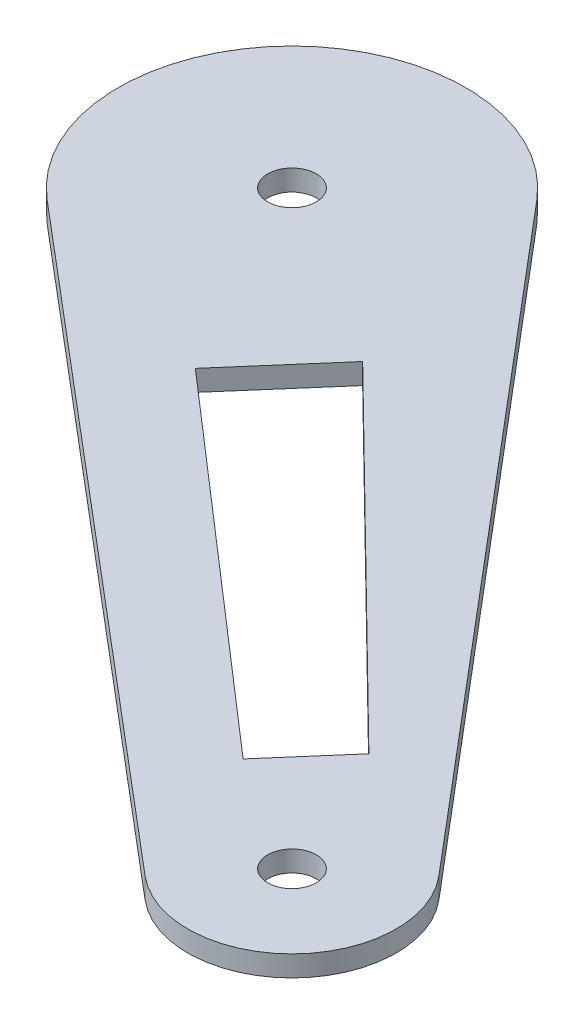
ISO-10303-21;
HEADER;
FILE_DESCRIPTION(('STEP AP214'),'2;1');
FILE_NAME('part.step','',(''),(''),'','','');
FILE_SCHEMA(('AUTOMOTIVE_DESIGN { 1 0 10303 214 1 1 1 1 }'));
ENDSEC;
DATA;
#1=APPLICATION_CONTEXT('core data for automotive mechanical design processes');
#2=APPLICATION_PROTOCOL_DEFINITION('international standard','automotive_design',2000,#1);
#3=PRODUCT_CONTEXT('',#1,'mechanical');
#4=PRODUCT('Part','Part','',(#3));
#5=PRODUCT_RELATED_PRODUCT_CATEGORY('part','',(#4));
#6=PRODUCT_DEFINITION_FORMATION('','',#4);
#7=PRODUCT_DEFINITION_CONTEXT('part definition',#1,'design');
#8=PRODUCT_DEFINITION('design','',#6,#7);
#9=PRODUCT_DEFINITION_SHAPE('','',#8);
#10=(LENGTH_UNIT() NAMED_UNIT(*) SI_UNIT(.MILLI.,.METRE.));
#11=(NAMED_UNIT(*) PLANE_ANGLE_UNIT() SI_UNIT($,.RADIAN.));
#12=(NAMED_UNIT(*) SI_UNIT($,.STERADIAN.) SOLID_ANGLE_UNIT());
#13=UNCERTAINTY_MEASURE_WITH_UNIT(LENGTH_MEASURE(1.E-05),#10,'distance_accuracy_value','');
#14=(GEOMETRIC_REPRESENTATION_CONTEXT(3) GLOBAL_UNCERTAINTY_ASSIGNED_CONTEXT((#13)) GLOBAL_UNIT_ASSIGNED_CONTEXT((#10,
#11,#12)) REPRESENTATION_CONTEXT('',''));
#15=CARTESIAN_POINT('',(0.,0.,0.));
#16=DIRECTION('',(0.,0.,1.));
#17=DIRECTION('',(1.,0.,0.));
#18=AXIS2_PLACEMENT_3D('',#15,#16,#17);
#19=CARTESIAN_POINT('',(-12.9144341357622,3.,15.2714567397174));
#20=DIRECTION('',(0.645721706788111,0.,-0.763572836985869));
#21=DIRECTION('',(-0.763572836985869,0.,-0.645721706788111));
#22=AXIS2_PLACEMENT_3D('',#19,#20,#21);
#23=PLANE('',#22);
#24=DIRECTION('',(0.763572836985869,0.,0.645721706788111));
#25=VECTOR('',#24,1.);
#26=CARTESIAN_POINT('',(-12.9144341357622,0.,15.2714567397174));
#27=LINE('',#26,#25);
#28=CARTESIAN_POINT('',(-58.5694495408956,0.,-23.3370859465461));
#29=VERTEX_POINT('',#28);
#30=CARTESIAN_POINT('',(32.7405812693714,0.,53.8799994259806));
#31=VERTEX_POINT('',#30);
#32=EDGE_CURVE('E172',#29,#31,#27,.T.);
#33=ORIENTED_EDGE('',*,*,#32,.T.);
#34=DIRECTION('',(0.,-1.,0.));
#35=VECTOR('',#34,1.);
#36=CARTESIAN_POINT('',(32.7405812693714,3.,53.8799994259806));
#37=LINE('',#36,#35);
#38=CARTESIAN_POINT('',(32.7405812693714,3.,53.8799994259806));
#39=VERTEX_POINT('',#38);
#40=EDGE_CURVE('E11',#39,#31,#37,.T.);
#41=ORIENTED_EDGE('',*,*,#40,.F.);
#42=DIRECTION('',(0.763572836985869,0.,0.645721706788111));
#43=VECTOR('',#42,1.);
#44=CARTESIAN_POINT('',(-12.9144341357622,3.,15.2714567397174));
#45=LINE('',#44,#43);
#46=CARTESIAN_POINT('',(-58.5694495408956,3.,-23.3370859465461));
#47=VERTEX_POINT('',#46);
#48=EDGE_CURVE('E176',#47,#39,#45,.T.);
#49=ORIENTED_EDGE('',*,*,#48,.F.);
#50=DIRECTION('',(0.,-1.,0.));
#51=VECTOR('',#50,1.);
#52=CARTESIAN_POINT('',(-58.5694495408956,3.,-23.3370859465461));
#53=LINE('',#52,#51);
#54=EDGE_CURVE('E191',#47,#29,#53,.T.);
#55=ORIENTED_EDGE('',*,*,#54,.T.);
#56=EDGE_LOOP('',(#33,#41,#49,#55));
#57=FACE_BOUND('',#56,.T.);
#58=ADVANCED_FACE('F46',(#57),#23,.F.);
#59=CARTESIAN_POINT('',(42.4264068711934,3.,42.4264068711923));
#60=DIRECTION('',(0.,-1.,0.));
#61=DIRECTION('',(0.,0.,-1.));
#62=AXIS2_PLACEMENT_3D('',#59,#60,#61);
#63=CYLINDRICAL_SURFACE('',#62,15.);
#64=CARTESIAN_POINT('',(42.4264068711934,0.,42.4264068711923));
#65=DIRECTION('',(0.,1.,0.));
#66=DIRECTION('',(0.,0.,1.));
#67=AXIS2_PLACEMENT_3D('',#64,#65,#66);
#68=CIRCLE('',#67,15.);
#69=CARTESIAN_POINT('',(53.8799994259812,0.,32.740581269371));
#70=VERTEX_POINT('',#69);
#71=EDGE_CURVE('E195',#31,#70,#68,.T.);
#72=ORIENTED_EDGE('',*,*,#71,.T.);
#73=DIRECTION('',(0.,-1.,0.));
#74=VECTOR('',#73,1.);
#75=CARTESIAN_POINT('',(53.8799994259812,3.,32.740581269371));
#76=LINE('',#75,#74);
#77=CARTESIAN_POINT('',(53.8799994259812,3.,32.740581269371));
#78=VERTEX_POINT('',#77);
#79=EDGE_CURVE('E54',#78,#70,#76,.T.);
#80=ORIENTED_EDGE('',*,*,#79,.F.);
#81=CARTESIAN_POINT('',(42.4264068711934,3.,42.4264068711923));
#82=DIRECTION('',(0.,1.,0.));
#83=DIRECTION('',(0.,0.,1.));
#84=AXIS2_PLACEMENT_3D('',#81,#82,#83);
#85=CIRCLE('',#84,15.);
#86=EDGE_CURVE('E180',#39,#78,#85,.T.);
#87=ORIENTED_EDGE('',*,*,#86,.F.);
#88=ORIENTED_EDGE('',*,*,#40,.T.);
#89=EDGE_LOOP('',(#72,#80,#87,#88));
#90=FACE_BOUND('',#89,.T.);
#91=ADVANCED_FACE('F217',(#90),#63,.T.);
#92=CARTESIAN_POINT('',(15.2714567397174,3.,-12.9144341357622));
#93=DIRECTION('',(0.763572836985869,0.,-0.645721706788111));
#94=DIRECTION('',(-0.645721706788111,0.,-0.763572836985869));
#95=AXIS2_PLACEMENT_3D('',#92,#93,#94);
#96=PLANE('',#95);
#97=DIRECTION('',(0.645721706788111,0.,0.763572836985869));
#98=VECTOR('',#97,1.);
#99=CARTESIAN_POINT('',(15.2714567397174,0.,-12.9144341357622));
#100=LINE('',#99,#98);
#101=CARTESIAN_POINT('',(-23.3370859465461,0.,-58.5694495408956));
#102=VERTEX_POINT('',#101);
#103=EDGE_CURVE('E199',#102,#70,#100,.T.);
#104=ORIENTED_EDGE('',*,*,#103,.F.);
#105=DIRECTION('',(0.,-1.,0.));
#106=VECTOR('',#105,1.);
#107=CARTESIAN_POINT('',(-23.3370859465461,3.,-58.5694495408956));
#108=LINE('',#107,#106);
#109=CARTESIAN_POINT('',(-23.3370859465461,3.,-58.5694495408956));
#110=VERTEX_POINT('',#109);
#111=EDGE_CURVE('E208',#110,#102,#108,.T.);
#112=ORIENTED_EDGE('',*,*,#111,.F.);
#113=DIRECTION('',(0.645721706788111,0.,0.763572836985869));
#114=VECTOR('',#113,1.);
#115=CARTESIAN_POINT('',(15.2714567397174,3.,-12.9144341357622));
#116=LINE('',#115,#114);
#117=EDGE_CURVE('E184',#110,#78,#116,.T.);
#118=ORIENTED_EDGE('',*,*,#117,.T.);
#119=ORIENTED_EDGE('',*,*,#79,.T.);
#120=EDGE_LOOP('',(#104,#112,#118,#119));
#121=FACE_BOUND('',#120,.T.);
#122=ADVANCED_FACE('F214',(#121),#96,.T.);
#123=CARTESIAN_POINT('',(-42.4264068711929,3.,-42.4264068711928));
#124=DIRECTION('',(0.,-1.,0.));
#125=DIRECTION('',(0.,0.,-1.));
#126=AXIS2_PLACEMENT_3D('',#123,#124,#125);
#127=CYLINDRICAL_SURFACE('',#126,25.);
#128=CARTESIAN_POINT('',(-42.4264068711929,0.,-42.4264068711928));
#129=DIRECTION('',(0.,1.,0.));
#130=DIRECTION('',(0.,0.,1.));
#131=AXIS2_PLACEMENT_3D('',#128,#129,#130);
#132=CIRCLE('',#131,25.);
#133=EDGE_CURVE('E181',#102,#29,#132,.T.);
#134=ORIENTED_EDGE('',*,*,#133,.T.);
#135=ORIENTED_EDGE('',*,*,#54,.F.);
#136=CARTESIAN_POINT('',(-42.4264068711929,3.,-42.4264068711928));
#137=DIRECTION('',(0.,1.,0.));
#138=DIRECTION('',(0.,0.,1.));
#139=AXIS2_PLACEMENT_3D('',#136,#137,#138);
#140=CIRCLE('',#139,25.);
#141=EDGE_CURVE('E188',#110,#47,#140,.T.);
#142=ORIENTED_EDGE('',*,*,#141,.F.);
#143=ORIENTED_EDGE('',*,*,#111,.T.);
#144=EDGE_LOOP('',(#134,#135,#142,#143));
#145=FACE_BOUND('',#144,.T.);
#146=ADVANCED_FACE('F224',(#145),#127,.T.);
#147=CARTESIAN_POINT('',(0.,3.,0.));
#148=DIRECTION('',(0.,1.,0.));
#149=DIRECTION('',(0.,0.,1.));
#150=AXIS2_PLACEMENT_3D('',#147,#148,#149);
#151=PLANE('',#150);
#152=DIRECTION('',(0.655504709377289,0.,-0.75519108574201));
#153=VECTOR('',#152,1.);
#154=CARTESIAN_POINT('',(30.3479863028157,3.,26.3420057746936));
#155=LINE('',#154,#153);
#156=CARTESIAN_POINT('',(25.2188438223983,3.,32.2511664920767));
#157=VERTEX_POINT('',#156);
#158=CARTESIAN_POINT('',(33.6266728578498,3.,22.5647104724889));
#159=VERTEX_POINT('',#158);
#160=EDGE_CURVE('E61',#157,#159,#155,.T.);
#161=ORIENTED_EDGE('',*,*,#160,.F.);
#162=DIRECTION('',(0.75519108574201,0.,0.655504709377289));
#163=VECTOR('',#162,1.);
#164=CARTESIAN_POINT('',(-5.12914248041741,3.,5.90916071738309));
#165=LINE('',#164,#163);
#166=CARTESIAN_POINT('',(-26.8914227625743,3.,-12.9804653402736));
#167=VERTEX_POINT('',#166);
#168=EDGE_CURVE('E132',#167,#157,#165,.T.);
#169=ORIENTED_EDGE('',*,*,#168,.F.);
#170=DIRECTION('',(-0.655504709377289,0.,0.75519108574201));
#171=VECTOR('',#170,1.);
#172=CARTESIAN_POINT('',(-21.7622802821569,3.,-18.8896260576567));
#173=LINE('',#172,#171);
#174=CARTESIAN_POINT('',(-15.7029996650353,3.,-25.8703763750824));
#175=VERTEX_POINT('',#174);
#176=EDGE_CURVE('E136',#175,#167,#173,.T.);
#177=ORIENTED_EDGE('',*,*,#176,.F.);
#178=DIRECTION('',(-0.713547212098277,0.,-0.700607148198458));
#179=VECTOR('',#178,1.);
#180=CARTESIAN_POINT('',(5.22519896008589,3.,-5.32170726521329));
#181=LINE('',#180,#179);
#182=EDGE_CURVE('E145',#159,#175,#181,.T.);
#183=ORIENTED_EDGE('',*,*,#182,.F.);
#184=EDGE_LOOP('',(#161,#169,#177,#183));
#185=FACE_BOUND('',#184,.T.);
#186=CARTESIAN_POINT('',(42.4264068711934,3.,42.4264068711923));
#187=DIRECTION('',(0.,1.,0.));
#188=DIRECTION('',(0.,0.,1.));
#189=AXIS2_PLACEMENT_3D('',#186,#187,#188);
#190=CIRCLE('',#189,3.5);
#191=CARTESIAN_POINT('',(42.4264068711934,3.,45.9264068711923));
#192=VERTEX_POINT('',#191);
#193=EDGE_CURVE('E154',#192,#192,#190,.T.);
#194=ORIENTED_EDGE('',*,*,#193,.F.);
#195=EDGE_LOOP('',(#194));
#196=FACE_BOUND('',#195,.T.);
#197=CARTESIAN_POINT('',(-42.4264068711929,3.,-42.4264068711928));
#198=DIRECTION('',(0.,1.,0.));
#199=DIRECTION('',(0.,0.,1.));
#200=AXIS2_PLACEMENT_3D('',#197,#198,#199);
#201=CIRCLE('',#200,3.5);
#202=CARTESIAN_POINT('',(-42.4264068711929,3.,-38.9264068711928));
#203=VERTEX_POINT('',#202);
#204=EDGE_CURVE('E164',#203,#203,#201,.T.);
#205=ORIENTED_EDGE('',*,*,#204,.F.);
#206=EDGE_LOOP('',(#205));
#207=FACE_BOUND('',#206,.T.);
#208=ORIENTED_EDGE('',*,*,#48,.T.);
#209=ORIENTED_EDGE('',*,*,#86,.T.);
#210=ORIENTED_EDGE('',*,*,#117,.F.);
#211=ORIENTED_EDGE('',*,*,#141,.T.);
#212=EDGE_LOOP('',(#208,#209,#210,#211));
#213=FACE_BOUND('',#212,.T.);
#214=ADVANCED_FACE('F229',(#185,#196,#207,#213),#151,.T.);
#215=CARTESIAN_POINT('',(0.,0.,0.));
#216=DIRECTION('',(0.,1.,0.));
#217=DIRECTION('',(0.,0.,1.));
#218=AXIS2_PLACEMENT_3D('',#215,#216,#217);
#219=PLANE('',#218);
#220=DIRECTION('',(0.75519108574201,0.,0.655504709377289));
#221=VECTOR('',#220,1.);
#222=CARTESIAN_POINT('',(-5.12914248041741,0.,5.90916071738309));
#223=LINE('',#222,#221);
#224=CARTESIAN_POINT('',(-26.8914227625743,0.,-12.9804653402736));
#225=VERTEX_POINT('',#224);
#226=CARTESIAN_POINT('',(25.2188438223983,0.,32.2511664920767));
#227=VERTEX_POINT('',#226);
#228=EDGE_CURVE('E120',#225,#227,#223,.T.);
#229=ORIENTED_EDGE('',*,*,#228,.T.);
#230=DIRECTION('',(0.655504709377289,0.,-0.75519108574201));
#231=VECTOR('',#230,1.);
#232=CARTESIAN_POINT('',(30.3479863028157,0.,26.3420057746936));
#233=LINE('',#232,#231);
#234=CARTESIAN_POINT('',(33.6266728578498,0.,22.5647104724889));
#235=VERTEX_POINT('',#234);
#236=EDGE_CURVE('E113',#227,#235,#233,.T.);
#237=ORIENTED_EDGE('',*,*,#236,.T.);
#238=DIRECTION('',(-0.713547212098277,0.,-0.700607148198458));
#239=VECTOR('',#238,1.);
#240=CARTESIAN_POINT('',(5.22519896008589,0.,-5.32170726521329));
#241=LINE('',#240,#239);
#242=CARTESIAN_POINT('',(-15.7029996650353,0.,-25.8703763750824));
#243=VERTEX_POINT('',#242);
#244=EDGE_CURVE('E123',#235,#243,#241,.T.);
#245=ORIENTED_EDGE('',*,*,#244,.T.);
#246=DIRECTION('',(-0.655504709377289,0.,0.75519108574201));
#247=VECTOR('',#246,1.);
#248=CARTESIAN_POINT('',(-21.7622802821569,0.,-18.8896260576567));
#249=LINE('',#248,#247);
#250=EDGE_CURVE('E69',#243,#225,#249,.T.);
#251=ORIENTED_EDGE('',*,*,#250,.T.);
#252=EDGE_LOOP('',(#229,#237,#245,#251));
#253=FACE_BOUND('',#252,.T.);
#254=CARTESIAN_POINT('',(42.4264068711934,0.,42.4264068711923));
#255=DIRECTION('',(0.,1.,0.));
#256=DIRECTION('',(0.,0.,1.));
#257=AXIS2_PLACEMENT_3D('',#254,#255,#256);
#258=CIRCLE('',#257,3.5);
#259=CARTESIAN_POINT('',(42.4264068711934,0.,45.9264068711923));
#260=VERTEX_POINT('',#259);
#261=EDGE_CURVE('E160',#260,#260,#258,.T.);
#262=ORIENTED_EDGE('',*,*,#261,.T.);
#263=EDGE_LOOP('',(#262));
#264=FACE_BOUND('',#263,.T.);
#265=CARTESIAN_POINT('',(-42.4264068711929,0.,-42.4264068711928));
#266=DIRECTION('',(0.,1.,0.));
#267=DIRECTION('',(0.,0.,1.));
#268=AXIS2_PLACEMENT_3D('',#265,#266,#267);
#269=CIRCLE('',#268,3.5);
#270=CARTESIAN_POINT('',(-42.4264068711929,0.,-38.9264068711928));
#271=VERTEX_POINT('',#270);
#272=EDGE_CURVE('E168',#271,#271,#269,.T.);
#273=ORIENTED_EDGE('',*,*,#272,.T.);
#274=EDGE_LOOP('',(#273));
#275=FACE_BOUND('',#274,.T.);
#276=ORIENTED_EDGE('',*,*,#32,.F.);
#277=ORIENTED_EDGE('',*,*,#133,.F.);
#278=ORIENTED_EDGE('',*,*,#103,.T.);
#279=ORIENTED_EDGE('',*,*,#71,.F.);
#280=EDGE_LOOP('',(#276,#277,#278,#279));
#281=FACE_BOUND('',#280,.T.);
#282=ADVANCED_FACE('F128',(#253,#264,#275,#281),#219,.F.);
#283=CARTESIAN_POINT('',(-42.4264068711929,0.,-42.4264068711928));
#284=DIRECTION('',(0.,1.,0.));
#285=DIRECTION('',(0.,0.,1.));
#286=AXIS2_PLACEMENT_3D('',#283,#284,#285);
#287=CYLINDRICAL_SURFACE('',#286,3.5);
#288=ORIENTED_EDGE('',*,*,#272,.F.);
#289=EDGE_LOOP('',(#288));
#290=FACE_BOUND('',#289,.T.);
#291=ORIENTED_EDGE('',*,*,#204,.T.);
#292=EDGE_LOOP('',(#291));
#293=FACE_BOUND('',#292,.T.);
#294=ADVANCED_FACE('F237',(#290,#293),#287,.F.);
#295=CARTESIAN_POINT('',(42.4264068711934,0.,42.4264068711923));
#296=DIRECTION('',(0.,1.,0.));
#297=DIRECTION('',(0.,0.,1.));
#298=AXIS2_PLACEMENT_3D('',#295,#296,#297);
#299=CYLINDRICAL_SURFACE('',#298,3.5);
#300=ORIENTED_EDGE('',*,*,#261,.F.);
#301=EDGE_LOOP('',(#300));
#302=FACE_BOUND('',#301,.T.);
#303=ORIENTED_EDGE('',*,*,#193,.T.);
#304=EDGE_LOOP('',(#303));
#305=FACE_BOUND('',#304,.T.);
#306=ADVANCED_FACE('F265',(#302,#305),#299,.F.);
#307=CARTESIAN_POINT('',(30.3479863028157,0.,26.3420057746936));
#308=DIRECTION('',(0.75519108574201,0.,0.655504709377289));
#309=DIRECTION('',(0.655504709377289,0.,-0.75519108574201));
#310=AXIS2_PLACEMENT_3D('',#307,#308,#309);
#311=PLANE('',#310);
#312=ORIENTED_EDGE('',*,*,#160,.T.);
#313=DIRECTION('',(0.,1.,0.));
#314=VECTOR('',#313,1.);
#315=CARTESIAN_POINT('',(33.6266728578498,0.,22.5647104724889));
#316=LINE('',#315,#314);
#317=EDGE_CURVE('E109',#235,#159,#316,.T.);
#318=ORIENTED_EDGE('',*,*,#317,.F.);
#319=ORIENTED_EDGE('',*,*,#236,.F.);
#320=DIRECTION('',(0.,1.,0.));
#321=VECTOR('',#320,1.);
#322=CARTESIAN_POINT('',(25.2188438223983,0.,32.2511664920767));
#323=LINE('',#322,#321);
#324=EDGE_CURVE('E151',#227,#157,#323,.T.);
#325=ORIENTED_EDGE('',*,*,#324,.T.);
#326=EDGE_LOOP('',(#312,#318,#319,#325));
#327=FACE_BOUND('',#326,.T.);
#328=ADVANCED_FACE('F111',(#327),#311,.F.);
#329=CARTESIAN_POINT('',(-5.12914248041741,0.,5.90916071738309));
#330=DIRECTION('',(-0.655504709377289,0.,0.75519108574201));
#331=DIRECTION('',(0.75519108574201,0.,0.655504709377289));
#332=AXIS2_PLACEMENT_3D('',#329,#330,#331);
#333=PLANE('',#332);
#334=ORIENTED_EDGE('',*,*,#168,.T.);
#335=ORIENTED_EDGE('',*,*,#324,.F.);
#336=ORIENTED_EDGE('',*,*,#228,.F.);
#337=DIRECTION('',(0.,1.,0.));
#338=VECTOR('',#337,1.);
#339=CARTESIAN_POINT('',(-26.8914227625743,0.,-12.9804653402736));
#340=LINE('',#339,#338);
#341=EDGE_CURVE('E155',#225,#167,#340,.T.);
#342=ORIENTED_EDGE('',*,*,#341,.T.);
#343=EDGE_LOOP('',(#334,#335,#336,#342));
#344=FACE_BOUND('',#343,.T.);
#345=ADVANCED_FACE('F285',(#344),#333,.F.);
#346=CARTESIAN_POINT('',(-21.7622802821569,0.,-18.8896260576567));
#347=DIRECTION('',(-0.75519108574201,0.,-0.655504709377289));
#348=DIRECTION('',(-0.655504709377289,0.,0.75519108574201));
#349=AXIS2_PLACEMENT_3D('',#346,#347,#348);
#350=PLANE('',#349);
#351=ORIENTED_EDGE('',*,*,#176,.T.);
#352=ORIENTED_EDGE('',*,*,#341,.F.);
#353=ORIENTED_EDGE('',*,*,#250,.F.);
#354=DIRECTION('',(0.,1.,0.));
#355=VECTOR('',#354,1.);
#356=CARTESIAN_POINT('',(-15.7029996650353,0.,-25.8703763750824));
#357=LINE('',#356,#355);
#358=EDGE_CURVE('E119',#243,#175,#357,.T.);
#359=ORIENTED_EDGE('',*,*,#358,.T.);
#360=EDGE_LOOP('',(#351,#352,#353,#359));
#361=FACE_BOUND('',#360,.T.);
#362=ADVANCED_FACE('F294',(#361),#350,.F.);
#363=CARTESIAN_POINT('',(5.22519896008589,0.,-5.32170726521329));
#364=DIRECTION('',(0.700607148198458,0.,-0.713547212098277));
#365=DIRECTION('',(-0.713547212098277,0.,-0.700607148198458));
#366=AXIS2_PLACEMENT_3D('',#363,#364,#365);
#367=PLANE('',#366);
#368=ORIENTED_EDGE('',*,*,#182,.T.);
#369=ORIENTED_EDGE('',*,*,#358,.F.);
#370=ORIENTED_EDGE('',*,*,#244,.F.);
#371=ORIENTED_EDGE('',*,*,#317,.T.);
#372=EDGE_LOOP('',(#368,#369,#370,#371));
#373=FACE_BOUND('',#372,.T.);
#374=ADVANCED_FACE('F124',(#373),#367,.F.);
#375=CLOSED_SHELL('',(#58,#91,#122,#146,#214,#282,#294,#306,#328,#345,#362,#374));
#376=MANIFOLD_SOLID_BREP('B2',#375);
#377=ADVANCED_BREP_SHAPE_REPRESENTATION('',(#18,#376),#14);
#378=SHAPE_DEFINITION_REPRESENTATION(#9,#377);
ENDSEC;
END-ISO-10303-21;
